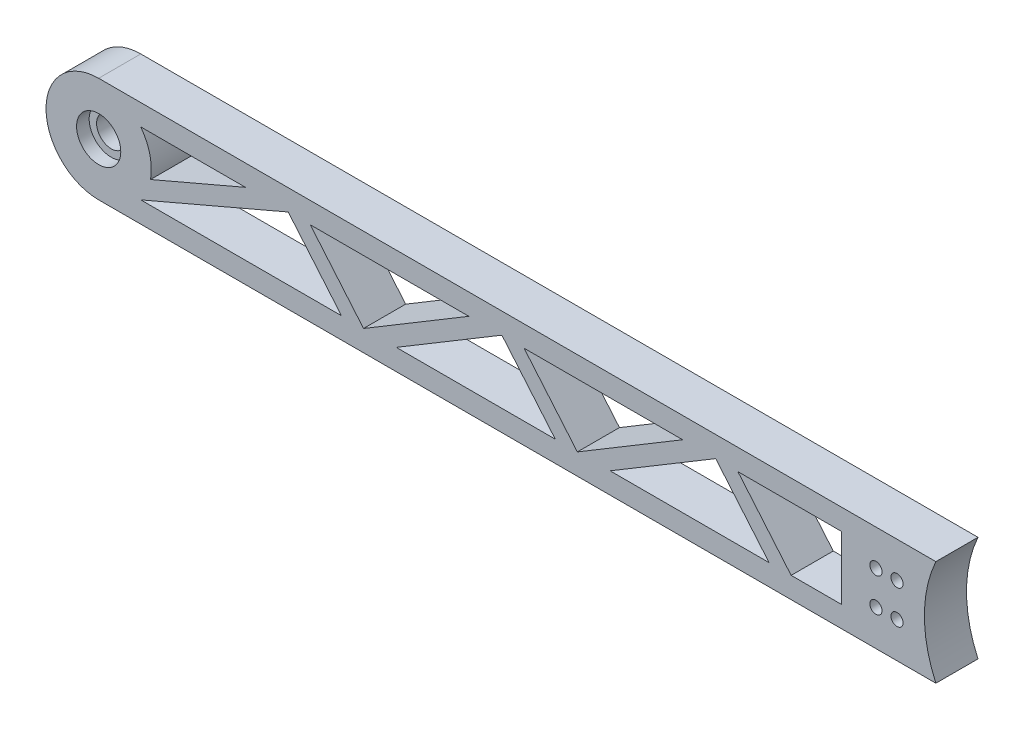
ISO-10303-21;
HEADER;
FILE_DESCRIPTION(('STEP AP214'),'2;1');
FILE_NAME('part.step','',(''),(''),'','','');
FILE_SCHEMA(('AUTOMOTIVE_DESIGN { 1 0 10303 214 1 1 1 1 }'));
ENDSEC;
DATA;
#1=APPLICATION_CONTEXT('core data for automotive mechanical design processes');
#2=APPLICATION_PROTOCOL_DEFINITION('international standard','automotive_design',2000,#1);
#3=PRODUCT_CONTEXT('',#1,'mechanical');
#4=PRODUCT('Part','Part','',(#3));
#5=PRODUCT_RELATED_PRODUCT_CATEGORY('part','',(#4));
#6=PRODUCT_DEFINITION_FORMATION('','',#4);
#7=PRODUCT_DEFINITION_CONTEXT('part definition',#1,'design');
#8=PRODUCT_DEFINITION('design','',#6,#7);
#9=PRODUCT_DEFINITION_SHAPE('','',#8);
#10=(LENGTH_UNIT() NAMED_UNIT(*) SI_UNIT(.MILLI.,.METRE.));
#11=(NAMED_UNIT(*) PLANE_ANGLE_UNIT() SI_UNIT($,.RADIAN.));
#12=(NAMED_UNIT(*) SI_UNIT($,.STERADIAN.) SOLID_ANGLE_UNIT());
#13=UNCERTAINTY_MEASURE_WITH_UNIT(LENGTH_MEASURE(1.E-05),#10,'distance_accuracy_value','');
#14=(GEOMETRIC_REPRESENTATION_CONTEXT(3) GLOBAL_UNCERTAINTY_ASSIGNED_CONTEXT((#13)) GLOBAL_UNIT_ASSIGNED_CONTEXT((#10,
#11,#12)) REPRESENTATION_CONTEXT('',''));
#15=CARTESIAN_POINT('',(0.,0.,0.));
#16=DIRECTION('',(0.,0.,1.));
#17=DIRECTION('',(1.,0.,0.));
#18=AXIS2_PLACEMENT_3D('',#15,#16,#17);
#19=CARTESIAN_POINT('',(0.,0.,10.000055));
#20=DIRECTION('',(0.,0.,-1.));
#21=DIRECTION('',(-1.,0.,0.));
#22=AXIS2_PLACEMENT_3D('',#19,#20,#21);
#23=CYLINDRICAL_SURFACE('',#22,3.5);
#24=CARTESIAN_POINT('',(0.,0.,0.));
#25=DIRECTION('',(0.,0.,-1.));
#26=DIRECTION('',(-1.,0.,0.));
#27=AXIS2_PLACEMENT_3D('',#24,#25,#26);
#28=CIRCLE('',#27,3.5);
#29=CARTESIAN_POINT('',(-3.5,0.,0.));
#30=VERTEX_POINT('',#29);
#31=EDGE_CURVE('E517',#30,#30,#28,.T.);
#32=ORIENTED_EDGE('',*,*,#31,.T.);
#33=EDGE_LOOP('',(#32));
#34=FACE_BOUND('',#33,.T.);
#35=CARTESIAN_POINT('',(0.,0.,7.));
#36=DIRECTION('',(0.,0.,1.));
#37=DIRECTION('',(1.,0.,0.));
#38=AXIS2_PLACEMENT_3D('',#35,#36,#37);
#39=CIRCLE('',#38,3.5);
#40=CARTESIAN_POINT('',(3.5,0.,7.));
#41=VERTEX_POINT('',#40);
#42=EDGE_CURVE('E514',#41,#41,#39,.F.);
#43=ORIENTED_EDGE('',*,*,#42,.F.);
#44=EDGE_LOOP('',(#43));
#45=FACE_BOUND('',#44,.T.);
#46=ADVANCED_FACE('F283',(#34,#45),#23,.F.);
#47=CARTESIAN_POINT('',(0.,0.,10.));
#48=DIRECTION('',(0.,0.,1.));
#49=DIRECTION('',(1.,0.,0.));
#50=AXIS2_PLACEMENT_3D('',#47,#48,#49);
#51=PLANE('',#50);
#52=CARTESIAN_POINT('',(184.5,-4.,10.));
#53=DIRECTION('',(0.,0.,1.));
#54=DIRECTION('',(1.,0.,0.));
#55=AXIS2_PLACEMENT_3D('',#52,#53,#54);
#56=CIRCLE('',#55,1.45);
#57=CARTESIAN_POINT('',(185.95,-4.,10.));
#58=VERTEX_POINT('',#57);
#59=EDGE_CURVE('E966',#58,#58,#56,.T.);
#60=ORIENTED_EDGE('',*,*,#59,.F.);
#61=EDGE_LOOP('',(#60));
#62=FACE_BOUND('',#61,.T.);
#63=CARTESIAN_POINT('',(189.5,-4.,10.));
#64=DIRECTION('',(0.,0.,1.));
#65=DIRECTION('',(1.,0.,0.));
#66=AXIS2_PLACEMENT_3D('',#63,#64,#65);
#67=CIRCLE('',#66,1.45);
#68=CARTESIAN_POINT('',(190.95,-4.,10.));
#69=VERTEX_POINT('',#68);
#70=EDGE_CURVE('E962',#69,#69,#67,.T.);
#71=ORIENTED_EDGE('',*,*,#70,.F.);
#72=EDGE_LOOP('',(#71));
#73=FACE_BOUND('',#72,.T.);
#74=CARTESIAN_POINT('',(189.5,4.,10.));
#75=DIRECTION('',(0.,0.,1.));
#76=DIRECTION('',(1.,0.,0.));
#77=AXIS2_PLACEMENT_3D('',#74,#75,#76);
#78=CIRCLE('',#77,1.45);
#79=CARTESIAN_POINT('',(190.95,4.,10.));
#80=VERTEX_POINT('',#79);
#81=EDGE_CURVE('E944',#80,#80,#78,.T.);
#82=ORIENTED_EDGE('',*,*,#81,.F.);
#83=EDGE_LOOP('',(#82));
#84=FACE_BOUND('',#83,.T.);
#85=CARTESIAN_POINT('',(184.5,4.,10.));
#86=DIRECTION('',(0.,0.,1.));
#87=DIRECTION('',(1.,0.,0.));
#88=AXIS2_PLACEMENT_3D('',#85,#86,#87);
#89=CIRCLE('',#88,1.45);
#90=CARTESIAN_POINT('',(185.95,4.,10.));
#91=VERTEX_POINT('',#90);
#92=EDGE_CURVE('E523',#91,#91,#89,.T.);
#93=ORIENTED_EDGE('',*,*,#92,.F.);
#94=EDGE_LOOP('',(#93));
#95=FACE_BOUND('',#94,.T.);
#96=CARTESIAN_POINT('',(226.,0.,10.));
#97=DIRECTION('',(0.,0.,1.));
#98=DIRECTION('',(1.,0.,0.));
#99=AXIS2_PLACEMENT_3D('',#96,#97,#98);
#100=CIRCLE('',#99,30.);
#101=CARTESIAN_POINT('',(198.728219713411,12.5,10.));
#102=VERTEX_POINT('',#101);
#103=CARTESIAN_POINT('',(198.728219713411,-12.5,10.));
#104=VERTEX_POINT('',#103);
#105=EDGE_CURVE('E530',#102,#104,#100,.T.);
#106=ORIENTED_EDGE('',*,*,#105,.F.);
#107=DIRECTION('',(-1.,0.,0.));
#108=VECTOR('',#107,1.);
#109=CARTESIAN_POINT('',(0.,12.5,10.));
#110=LINE('',#109,#108);
#111=CARTESIAN_POINT('',(0.,12.5,10.));
#112=VERTEX_POINT('',#111);
#113=EDGE_CURVE('E496',#102,#112,#110,.T.);
#114=ORIENTED_EDGE('',*,*,#113,.T.);
#115=CARTESIAN_POINT('',(0.,0.,10.));
#116=DIRECTION('',(0.,0.,1.));
#117=DIRECTION('',(1.,0.,0.));
#118=AXIS2_PLACEMENT_3D('',#115,#116,#117);
#119=CIRCLE('',#118,12.5);
#120=CARTESIAN_POINT('',(0.,-12.5,10.));
#121=VERTEX_POINT('',#120);
#122=EDGE_CURVE('E489',#112,#121,#119,.T.);
#123=ORIENTED_EDGE('',*,*,#122,.T.);
#124=DIRECTION('',(1.,0.,0.));
#125=VECTOR('',#124,1.);
#126=CARTESIAN_POINT('',(0.,-12.5,10.));
#127=LINE('',#126,#125);
#128=EDGE_CURVE('E492',#121,#104,#127,.T.);
#129=ORIENTED_EDGE('',*,*,#128,.T.);
#130=EDGE_LOOP('',(#106,#114,#123,#129));
#131=FACE_BOUND('',#130,.T.);
#132=CARTESIAN_POINT('',(0.,0.,10.));
#133=DIRECTION('',(0.,0.,1.));
#134=DIRECTION('',(1.,0.,0.));
#135=AXIS2_PLACEMENT_3D('',#132,#133,#134);
#136=CIRCLE('',#135,5.25);
#137=CARTESIAN_POINT('',(5.25,0.,10.));
#138=VERTEX_POINT('',#137);
#139=EDGE_CURVE('E545',#138,#138,#136,.T.);
#140=ORIENTED_EDGE('',*,*,#139,.F.);
#141=EDGE_LOOP('',(#140));
#142=FACE_BOUND('',#141,.T.);
#143=DIRECTION('',(0.644427186177513,-0.764665679702792,0.));
#144=VECTOR('',#143,1.);
#145=CARTESIAN_POINT('',(33.0665599385315,27.8670675870274,10.));
#146=LINE('',#145,#144);
#147=CARTESIAN_POINT('',(50.2310442408697,7.5,10.));
#148=VERTEX_POINT('',#147);
#149=CARTESIAN_POINT('',(62.8723959442963,-7.50000000000001,10.));
#150=VERTEX_POINT('',#149);
#151=EDGE_CURVE('E455',#148,#150,#146,.T.);
#152=ORIENTED_EDGE('',*,*,#151,.F.);
#153=DIRECTION('',(1.,0.,0.));
#154=VECTOR('',#153,1.);
#155=CARTESIAN_POINT('',(0.,7.5,10.));
#156=LINE('',#155,#154);
#157=CARTESIAN_POINT('',(87.8723959442963,7.49999999999999,10.));
#158=VERTEX_POINT('',#157);
#159=EDGE_CURVE('E459',#148,#158,#156,.T.);
#160=ORIENTED_EDGE('',*,*,#159,.T.);
#161=DIRECTION('',(0.857492925712545,0.514495755427526,0.));
#162=VECTOR('',#161,1.);
#163=CARTESIAN_POINT('',(19.9515165734902,-33.2525276224836,10.));
#164=LINE('',#163,#162);
#165=EDGE_CURVE('E691',#150,#158,#164,.T.);
#166=ORIENTED_EDGE('',*,*,#165,.F.);
#167=EDGE_LOOP('',(#152,#160,#166));
#168=FACE_BOUND('',#167,.T.);
#169=DIRECTION('',(-0.919145030018058,-0.393919298579168,0.));
#170=VECTOR('',#169,1.);
#171=CARTESIAN_POINT('',(34.8456358588481,7.50000000000001,10.));
#172=LINE('',#171,#170);
#173=CARTESIAN_POINT('',(34.8456358588481,7.5,10.));
#174=VERTEX_POINT('',#173);
#175=CARTESIAN_POINT('',(12.3124755692208,-2.15706869555459,10.));
#176=VERTEX_POINT('',#175);
#177=EDGE_CURVE('E506',#174,#176,#172,.T.);
#178=ORIENTED_EDGE('',*,*,#177,.T.);
#179=CARTESIAN_POINT('',(0.,0.,10.));
#180=DIRECTION('',(0.,0.,1.));
#181=DIRECTION('',(1.,0.,0.));
#182=AXIS2_PLACEMENT_3D('',#179,#180,#181);
#183=CIRCLE('',#182,12.5);
#184=CARTESIAN_POINT('',(10.,7.5,10.));
#185=VERTEX_POINT('',#184);
#186=EDGE_CURVE('E511',#176,#185,#183,.T.);
#187=ORIENTED_EDGE('',*,*,#186,.T.);
#188=DIRECTION('',(1.,0.,0.));
#189=VECTOR('',#188,1.);
#190=CARTESIAN_POINT('',(0.,7.5,10.));
#191=LINE('',#190,#189);
#192=EDGE_CURVE('E331',#185,#174,#191,.T.);
#193=ORIENTED_EDGE('',*,*,#192,.T.);
#194=EDGE_LOOP('',(#178,#187,#193));
#195=FACE_BOUND('',#194,.T.);
#196=DIRECTION('',(0.644427186177513,-0.764665679702792,0.));
#197=VECTOR('',#196,1.);
#198=CARTESIAN_POINT('',(62.7420644515224,52.87630022205,10.));
#199=LINE('',#198,#197);
#200=CARTESIAN_POINT('',(100.983249125336,7.5,10.));
#201=VERTEX_POINT('',#200);
#202=CARTESIAN_POINT('',(113.624600828763,-7.5,10.));
#203=VERTEX_POINT('',#202);
#204=EDGE_CURVE('E340',#201,#203,#199,.T.);
#205=ORIENTED_EDGE('',*,*,#204,.F.);
#206=DIRECTION('',(1.,0.,0.));
#207=VECTOR('',#206,1.);
#208=CARTESIAN_POINT('',(0.,7.5,10.));
#209=LINE('',#208,#207);
#210=CARTESIAN_POINT('',(138.624600828763,7.5,10.));
#211=VERTEX_POINT('',#210);
#212=EDGE_CURVE('E678',#201,#211,#209,.T.);
#213=ORIENTED_EDGE('',*,*,#212,.T.);
#214=DIRECTION('',(0.857492925712545,0.514495755427526,0.));
#215=VECTOR('',#214,1.);
#216=CARTESIAN_POINT('',(33.3859237487901,-55.6432062479835,10.));
#217=LINE('',#216,#215);
#218=EDGE_CURVE('E676',#203,#211,#217,.T.);
#219=ORIENTED_EDGE('',*,*,#218,.F.);
#220=EDGE_LOOP('',(#205,#213,#219));
#221=FACE_BOUND('',#220,.T.);
#222=DIRECTION('',(0.644427186177514,-0.764665679702791,0.));
#223=VECTOR('',#222,1.);
#224=CARTESIAN_POINT('',(92.4175689645131,77.8855328570726,10.));
#225=LINE('',#224,#223);
#226=CARTESIAN_POINT('',(151.735454009803,7.50000000000001,10.));
#227=VERTEX_POINT('',#226);
#228=CARTESIAN_POINT('',(164.376805713229,-7.5,10.));
#229=VERTEX_POINT('',#228);
#230=EDGE_CURVE('E681',#227,#229,#225,.T.);
#231=ORIENTED_EDGE('',*,*,#230,.F.);
#232=DIRECTION('',(1.,0.,0.));
#233=VECTOR('',#232,1.);
#234=CARTESIAN_POINT('',(0.,7.5,10.));
#235=LINE('',#234,#233);
#236=CARTESIAN_POINT('',(176.376805713229,7.5,10.));
#237=VERTEX_POINT('',#236);
#238=EDGE_CURVE('E688',#227,#237,#235,.T.);
#239=ORIENTED_EDGE('',*,*,#238,.T.);
#240=DIRECTION('',(0.,-1.,0.));
#241=VECTOR('',#240,1.);
#242=CARTESIAN_POINT('',(176.376805713229,0.,10.));
#243=LINE('',#242,#241);
#244=CARTESIAN_POINT('',(176.376805713229,-7.5,10.));
#245=VERTEX_POINT('',#244);
#246=EDGE_CURVE('E685',#237,#245,#243,.T.);
#247=ORIENTED_EDGE('',*,*,#246,.T.);
#248=DIRECTION('',(1.,0.,0.));
#249=VECTOR('',#248,1.);
#250=CARTESIAN_POINT('',(0.,-7.5,10.));
#251=LINE('',#250,#249);
#252=EDGE_CURVE('E683',#229,#245,#251,.T.);
#253=ORIENTED_EDGE('',*,*,#252,.F.);
#254=EDGE_LOOP('',(#231,#239,#247,#253));
#255=FACE_BOUND('',#254,.T.);
#256=DIRECTION('',(0.919145030018058,0.393919298579168,0.));
#257=VECTOR('',#256,1.);
#258=CARTESIAN_POINT('',(4.26724137931035,-9.95689655172414,10.));
#259=LINE('',#258,#257);
#260=CARTESIAN_POINT('',(10.,-7.5,10.));
#261=VERTEX_POINT('',#260);
#262=CARTESIAN_POINT('',(45.,7.5,10.));
#263=VERTEX_POINT('',#262);
#264=EDGE_CURVE('E431',#261,#263,#259,.T.);
#265=ORIENTED_EDGE('',*,*,#264,.T.);
#266=DIRECTION('',(0.644427186177514,-0.764665679702792,0.));
#267=VECTOR('',#266,1.);
#268=CARTESIAN_POINT('',(30.0078972197203,25.2893588423174,10.));
#269=LINE('',#268,#267);
#270=CARTESIAN_POINT('',(57.6413517034265,-7.5,10.));
#271=VERTEX_POINT('',#270);
#272=EDGE_CURVE('E444',#263,#271,#269,.T.);
#273=ORIENTED_EDGE('',*,*,#272,.T.);
#274=DIRECTION('',(1.,0.,0.));
#275=VECTOR('',#274,1.);
#276=CARTESIAN_POINT('',(0.,-7.5,10.));
#277=LINE('',#276,#275);
#278=EDGE_CURVE('E451',#261,#271,#277,.T.);
#279=ORIENTED_EDGE('',*,*,#278,.F.);
#280=EDGE_LOOP('',(#265,#273,#279));
#281=FACE_BOUND('',#280,.T.);
#282=DIRECTION('',(1.,0.,0.));
#283=VECTOR('',#282,1.);
#284=CARTESIAN_POINT('',(0.,7.5,10.));
#285=LINE('',#284,#283);
#286=CARTESIAN_POINT('',(95.6469984707566,7.5,10.));
#287=VERTEX_POINT('',#286);
#288=CARTESIAN_POINT('',(95.7522048844664,7.5,10.));
#289=VERTEX_POINT('',#288);
#290=EDGE_CURVE('E450',#287,#289,#285,.T.);
#291=ORIENTED_EDGE('',*,*,#290,.T.);
#292=DIRECTION('',(0.644427186177514,-0.764665679702792,0.));
#293=VECTOR('',#292,1.);
#294=CARTESIAN_POINT('',(59.6834017327112,50.29859147734,10.));
#295=LINE('',#294,#293);
#296=CARTESIAN_POINT('',(108.393556587893,-7.5,10.));
#297=VERTEX_POINT('',#296);
#298=EDGE_CURVE('E474',#289,#297,#295,.T.);
#299=ORIENTED_EDGE('',*,*,#298,.T.);
#300=DIRECTION('',(1.,0.,0.));
#301=VECTOR('',#300,1.);
#302=CARTESIAN_POINT('',(0.,-7.5,10.));
#303=LINE('',#302,#301);
#304=CARTESIAN_POINT('',(70.6469984707566,-7.5,10.));
#305=VERTEX_POINT('',#304);
#306=EDGE_CURVE('E472',#305,#297,#303,.T.);
#307=ORIENTED_EDGE('',*,*,#306,.F.);
#308=DIRECTION('',(0.857492925712544,0.514495755427526,0.));
#309=VECTOR('',#308,1.);
#310=CARTESIAN_POINT('',(22.0094995952003,-36.6824993253338,10.));
#311=LINE('',#310,#309);
#312=EDGE_CURVE('E469',#305,#287,#311,.T.);
#313=ORIENTED_EDGE('',*,*,#312,.T.);
#314=EDGE_LOOP('',(#291,#299,#307,#313));
#315=FACE_BOUND('',#314,.T.);
#316=DIRECTION('',(1.,0.,0.));
#317=VECTOR('',#316,1.);
#318=CARTESIAN_POINT('',(0.,7.5,10.));
#319=LINE('',#318,#317);
#320=CARTESIAN_POINT('',(146.399203355223,7.5,10.));
#321=VERTEX_POINT('',#320);
#322=CARTESIAN_POINT('',(146.504409768933,7.5,10.));
#323=VERTEX_POINT('',#322);
#324=EDGE_CURVE('E477',#321,#323,#319,.T.);
#325=ORIENTED_EDGE('',*,*,#324,.T.);
#326=DIRECTION('',(0.644427186177514,-0.764665679702791,0.));
#327=VECTOR('',#326,1.);
#328=CARTESIAN_POINT('',(89.358906245702,75.3078241123626,10.));
#329=LINE('',#328,#327);
#330=CARTESIAN_POINT('',(159.145761472359,-7.5,10.));
#331=VERTEX_POINT('',#330);
#332=EDGE_CURVE('E485',#323,#331,#329,.T.);
#333=ORIENTED_EDGE('',*,*,#332,.T.);
#334=DIRECTION('',(1.,0.,0.));
#335=VECTOR('',#334,1.);
#336=CARTESIAN_POINT('',(0.,-7.5,10.));
#337=LINE('',#336,#335);
#338=CARTESIAN_POINT('',(121.399203355223,-7.5,10.));
#339=VERTEX_POINT('',#338);
#340=EDGE_CURVE('E483',#339,#331,#337,.T.);
#341=ORIENTED_EDGE('',*,*,#340,.F.);
#342=DIRECTION('',(0.857492925712545,0.514495755427526,0.));
#343=VECTOR('',#342,1.);
#344=CARTESIAN_POINT('',(35.4439067705002,-59.0731779508337,10.));
#345=LINE('',#344,#343);
#346=EDGE_CURVE('E480',#339,#321,#345,.T.);
#347=ORIENTED_EDGE('',*,*,#346,.T.);
#348=EDGE_LOOP('',(#325,#333,#341,#347));
#349=FACE_BOUND('',#348,.T.);
#350=ADVANCED_FACE('F453',(#62,#73,#84,#95,#131,#142,#168,#195,#221,#255,#281,#315,#349),#51,.T.);
#351=CARTESIAN_POINT('',(0.,0.,0.));
#352=DIRECTION('',(0.,0.,1.));
#353=DIRECTION('',(1.,0.,0.));
#354=AXIS2_PLACEMENT_3D('',#351,#352,#353);
#355=PLANE('',#354);
#356=CARTESIAN_POINT('',(184.5,-4.,0.));
#357=DIRECTION('',(0.,0.,1.));
#358=DIRECTION('',(1.,0.,0.));
#359=AXIS2_PLACEMENT_3D('',#356,#357,#358);
#360=CIRCLE('',#359,1.45);
#361=CARTESIAN_POINT('',(185.95,-4.,0.));
#362=VERTEX_POINT('',#361);
#363=EDGE_CURVE('E287',#362,#362,#360,.T.);
#364=ORIENTED_EDGE('',*,*,#363,.T.);
#365=EDGE_LOOP('',(#364));
#366=FACE_BOUND('',#365,.T.);
#367=CARTESIAN_POINT('',(189.5,-4.,0.));
#368=DIRECTION('',(0.,0.,1.));
#369=DIRECTION('',(1.,0.,0.));
#370=AXIS2_PLACEMENT_3D('',#367,#368,#369);
#371=CIRCLE('',#370,1.45);
#372=CARTESIAN_POINT('',(190.95,-4.,0.));
#373=VERTEX_POINT('',#372);
#374=EDGE_CURVE('E525',#373,#373,#371,.T.);
#375=ORIENTED_EDGE('',*,*,#374,.T.);
#376=EDGE_LOOP('',(#375));
#377=FACE_BOUND('',#376,.T.);
#378=CARTESIAN_POINT('',(189.5,4.,0.));
#379=DIRECTION('',(0.,0.,1.));
#380=DIRECTION('',(1.,0.,0.));
#381=AXIS2_PLACEMENT_3D('',#378,#379,#380);
#382=CIRCLE('',#381,1.45);
#383=CARTESIAN_POINT('',(190.95,4.,0.));
#384=VERTEX_POINT('',#383);
#385=EDGE_CURVE('E522',#384,#384,#382,.T.);
#386=ORIENTED_EDGE('',*,*,#385,.T.);
#387=EDGE_LOOP('',(#386));
#388=FACE_BOUND('',#387,.T.);
#389=CARTESIAN_POINT('',(184.5,4.,0.));
#390=DIRECTION('',(0.,0.,1.));
#391=DIRECTION('',(1.,0.,0.));
#392=AXIS2_PLACEMENT_3D('',#389,#390,#391);
#393=CIRCLE('',#392,1.45);
#394=CARTESIAN_POINT('',(185.95,4.,0.));
#395=VERTEX_POINT('',#394);
#396=EDGE_CURVE('E519',#395,#395,#393,.T.);
#397=ORIENTED_EDGE('',*,*,#396,.T.);
#398=EDGE_LOOP('',(#397));
#399=FACE_BOUND('',#398,.T.);
#400=ORIENTED_EDGE('',*,*,#31,.F.);
#401=EDGE_LOOP('',(#400));
#402=FACE_BOUND('',#401,.T.);
#403=DIRECTION('',(0.644427186177514,-0.764665679702792,0.));
#404=VECTOR('',#403,1.);
#405=CARTESIAN_POINT('',(59.6834017327112,50.29859147734,0.));
#406=LINE('',#405,#404);
#407=CARTESIAN_POINT('',(95.7522048844664,7.5,0.));
#408=VERTEX_POINT('',#407);
#409=CARTESIAN_POINT('',(108.393556587893,-7.5,0.));
#410=VERTEX_POINT('',#409);
#411=EDGE_CURVE('E592',#408,#410,#406,.T.);
#412=ORIENTED_EDGE('',*,*,#411,.F.);
#413=DIRECTION('',(1.,0.,0.));
#414=VECTOR('',#413,1.);
#415=CARTESIAN_POINT('',(0.,7.5,0.));
#416=LINE('',#415,#414);
#417=CARTESIAN_POINT('',(95.6469984707566,7.5,0.));
#418=VERTEX_POINT('',#417);
#419=EDGE_CURVE('E595',#418,#408,#416,.T.);
#420=ORIENTED_EDGE('',*,*,#419,.F.);
#421=DIRECTION('',(0.857492925712544,0.514495755427526,0.));
#422=VECTOR('',#421,1.);
#423=CARTESIAN_POINT('',(22.0094995952003,-36.6824993253338,0.));
#424=LINE('',#423,#422);
#425=CARTESIAN_POINT('',(70.6469984707566,-7.5,0.));
#426=VERTEX_POINT('',#425);
#427=EDGE_CURVE('E599',#426,#418,#424,.T.);
#428=ORIENTED_EDGE('',*,*,#427,.F.);
#429=DIRECTION('',(1.,0.,0.));
#430=VECTOR('',#429,1.);
#431=CARTESIAN_POINT('',(0.,-7.5,0.));
#432=LINE('',#431,#430);
#433=EDGE_CURVE('E602',#426,#410,#432,.T.);
#434=ORIENTED_EDGE('',*,*,#433,.T.);
#435=EDGE_LOOP('',(#412,#420,#428,#434));
#436=FACE_BOUND('',#435,.T.);
#437=DIRECTION('',(1.,0.,0.));
#438=VECTOR('',#437,1.);
#439=CARTESIAN_POINT('',(0.,7.5,0.));
#440=LINE('',#439,#438);
#441=CARTESIAN_POINT('',(151.735454009803,7.50000000000001,0.));
#442=VERTEX_POINT('',#441);
#443=CARTESIAN_POINT('',(176.376805713229,7.5,0.));
#444=VERTEX_POINT('',#443);
#445=EDGE_CURVE('E553',#442,#444,#440,.T.);
#446=ORIENTED_EDGE('',*,*,#445,.F.);
#447=DIRECTION('',(0.644427186177514,-0.764665679702791,0.));
#448=VECTOR('',#447,1.);
#449=CARTESIAN_POINT('',(92.4175689645131,77.8855328570727,0.));
#450=LINE('',#449,#448);
#451=CARTESIAN_POINT('',(164.376805713229,-7.49999999999999,0.));
#452=VERTEX_POINT('',#451);
#453=EDGE_CURVE('E556',#442,#452,#450,.T.);
#454=ORIENTED_EDGE('',*,*,#453,.T.);
#455=DIRECTION('',(1.,0.,0.));
#456=VECTOR('',#455,1.);
#457=CARTESIAN_POINT('',(0.,-7.5,0.));
#458=LINE('',#457,#456);
#459=CARTESIAN_POINT('',(176.376805713229,-7.5,0.));
#460=VERTEX_POINT('',#459);
#461=EDGE_CURVE('E560',#452,#460,#458,.T.);
#462=ORIENTED_EDGE('',*,*,#461,.T.);
#463=DIRECTION('',(0.,-1.,0.));
#464=VECTOR('',#463,1.);
#465=CARTESIAN_POINT('',(176.376805713229,0.,0.));
#466=LINE('',#465,#464);
#467=EDGE_CURVE('E563',#444,#460,#466,.T.);
#468=ORIENTED_EDGE('',*,*,#467,.F.);
#469=EDGE_LOOP('',(#446,#454,#462,#468));
#470=FACE_BOUND('',#469,.T.);
#471=CARTESIAN_POINT('',(0.,0.,0.));
#472=DIRECTION('',(0.,0.,1.));
#473=DIRECTION('',(1.,0.,0.));
#474=AXIS2_PLACEMENT_3D('',#471,#472,#473);
#475=CIRCLE('',#474,12.5);
#476=CARTESIAN_POINT('',(12.3124755692208,-2.15706869555459,0.));
#477=VERTEX_POINT('',#476);
#478=CARTESIAN_POINT('',(10.,7.5,0.));
#479=VERTEX_POINT('',#478);
#480=EDGE_CURVE('E657',#477,#479,#475,.T.);
#481=ORIENTED_EDGE('',*,*,#480,.F.);
#482=DIRECTION('',(-0.919145030018058,-0.393919298579168,0.));
#483=VECTOR('',#482,1.);
#484=CARTESIAN_POINT('',(2.69156418499368,-6.28031643165192,0.));
#485=LINE('',#484,#483);
#486=CARTESIAN_POINT('',(34.8456358588481,7.5,0.));
#487=VERTEX_POINT('',#486);
#488=EDGE_CURVE('E664',#487,#477,#485,.T.);
#489=ORIENTED_EDGE('',*,*,#488,.F.);
#490=DIRECTION('',(1.,0.,0.));
#491=VECTOR('',#490,1.);
#492=CARTESIAN_POINT('',(0.,7.5,0.));
#493=LINE('',#492,#491);
#494=EDGE_CURVE('E667',#479,#487,#493,.T.);
#495=ORIENTED_EDGE('',*,*,#494,.F.);
#496=EDGE_LOOP('',(#481,#489,#495));
#497=FACE_BOUND('',#496,.T.);
#498=DIRECTION('',(-1.,0.,0.));
#499=VECTOR('',#498,1.);
#500=CARTESIAN_POINT('',(0.,12.5,0.));
#501=LINE('',#500,#499);
#502=CARTESIAN_POINT('',(198.728219713411,12.5,0.));
#503=VERTEX_POINT('',#502);
#504=CARTESIAN_POINT('',(0.,12.5,0.));
#505=VERTEX_POINT('',#504);
#506=EDGE_CURVE('E493',#503,#505,#501,.T.);
#507=ORIENTED_EDGE('',*,*,#506,.F.);
#508=CARTESIAN_POINT('',(226.,0.,0.));
#509=DIRECTION('',(0.,0.,1.));
#510=DIRECTION('',(1.,0.,0.));
#511=AXIS2_PLACEMENT_3D('',#508,#509,#510);
#512=CIRCLE('',#511,30.);
#513=CARTESIAN_POINT('',(198.728219713411,-12.5,0.));
#514=VERTEX_POINT('',#513);
#515=EDGE_CURVE('E300',#503,#514,#512,.T.);
#516=ORIENTED_EDGE('',*,*,#515,.T.);
#517=DIRECTION('',(1.,0.,0.));
#518=VECTOR('',#517,1.);
#519=CARTESIAN_POINT('',(0.,-12.5,0.));
#520=LINE('',#519,#518);
#521=CARTESIAN_POINT('',(0.,-12.5,0.));
#522=VERTEX_POINT('',#521);
#523=EDGE_CURVE('E500',#522,#514,#520,.T.);
#524=ORIENTED_EDGE('',*,*,#523,.F.);
#525=CARTESIAN_POINT('',(0.,0.,0.));
#526=DIRECTION('',(0.,0.,1.));
#527=DIRECTION('',(1.,0.,0.));
#528=AXIS2_PLACEMENT_3D('',#525,#526,#527);
#529=CIRCLE('',#528,12.5);
#530=EDGE_CURVE('E488',#505,#522,#529,.T.);
#531=ORIENTED_EDGE('',*,*,#530,.F.);
#532=EDGE_LOOP('',(#507,#516,#524,#531));
#533=FACE_BOUND('',#532,.T.);
#534=DIRECTION('',(1.,0.,0.));
#535=VECTOR('',#534,1.);
#536=CARTESIAN_POINT('',(0.,7.5,0.));
#537=LINE('',#536,#535);
#538=CARTESIAN_POINT('',(100.983249125336,7.5,0.));
#539=VERTEX_POINT('',#538);
#540=CARTESIAN_POINT('',(138.624600828763,7.5,0.));
#541=VERTEX_POINT('',#540);
#542=EDGE_CURVE('E552',#539,#541,#537,.T.);
#543=ORIENTED_EDGE('',*,*,#542,.F.);
#544=DIRECTION('',(0.644427186177513,-0.764665679702792,0.));
#545=VECTOR('',#544,1.);
#546=CARTESIAN_POINT('',(62.7420644515224,52.87630022205,0.));
#547=LINE('',#546,#545);
#548=CARTESIAN_POINT('',(113.624600828763,-7.5,0.));
#549=VERTEX_POINT('',#548);
#550=EDGE_CURVE('E580',#539,#549,#547,.T.);
#551=ORIENTED_EDGE('',*,*,#550,.T.);
#552=DIRECTION('',(0.857492925712545,0.514495755427526,0.));
#553=VECTOR('',#552,1.);
#554=CARTESIAN_POINT('',(33.3859237487901,-55.6432062479835,0.));
#555=LINE('',#554,#553);
#556=EDGE_CURVE('E583',#549,#541,#555,.T.);
#557=ORIENTED_EDGE('',*,*,#556,.T.);
#558=EDGE_LOOP('',(#543,#551,#557));
#559=FACE_BOUND('',#558,.T.);
#560=DIRECTION('',(1.,0.,0.));
#561=VECTOR('',#560,1.);
#562=CARTESIAN_POINT('',(0.,7.5,0.));
#563=LINE('',#562,#561);
#564=CARTESIAN_POINT('',(50.2310442408697,7.5,0.));
#565=VERTEX_POINT('',#564);
#566=CARTESIAN_POINT('',(87.8723959442963,7.49999999999998,0.));
#567=VERTEX_POINT('',#566);
#568=EDGE_CURVE('E641',#565,#567,#563,.T.);
#569=ORIENTED_EDGE('',*,*,#568,.F.);
#570=DIRECTION('',(0.644427186177513,-0.764665679702792,0.));
#571=VECTOR('',#570,1.);
#572=CARTESIAN_POINT('',(33.0665599385315,27.8670675870274,0.));
#573=LINE('',#572,#571);
#574=CARTESIAN_POINT('',(62.8723959442963,-7.5,0.));
#575=VERTEX_POINT('',#574);
#576=EDGE_CURVE('E609',#565,#575,#573,.T.);
#577=ORIENTED_EDGE('',*,*,#576,.T.);
#578=DIRECTION('',(0.857492925712545,0.514495755427526,0.));
#579=VECTOR('',#578,1.);
#580=CARTESIAN_POINT('',(19.9515165734902,-33.2525276224836,0.));
#581=LINE('',#580,#579);
#582=EDGE_CURVE('E638',#575,#567,#581,.T.);
#583=ORIENTED_EDGE('',*,*,#582,.T.);
#584=EDGE_LOOP('',(#569,#577,#583));
#585=FACE_BOUND('',#584,.T.);
#586=DIRECTION('',(0.644427186177514,-0.764665679702792,0.));
#587=VECTOR('',#586,1.);
#588=CARTESIAN_POINT('',(30.0078972197203,25.2893588423174,0.));
#589=LINE('',#588,#587);
#590=CARTESIAN_POINT('',(45.,7.5,0.));
#591=VERTEX_POINT('',#590);
#592=CARTESIAN_POINT('',(57.6413517034265,-7.5,0.));
#593=VERTEX_POINT('',#592);
#594=EDGE_CURVE('E648',#591,#593,#589,.T.);
#595=ORIENTED_EDGE('',*,*,#594,.F.);
#596=DIRECTION('',(0.919145030018058,0.393919298579168,0.));
#597=VECTOR('',#596,1.);
#598=CARTESIAN_POINT('',(4.26724137931035,-9.95689655172414,0.));
#599=LINE('',#598,#597);
#600=CARTESIAN_POINT('',(10.,-7.5,0.));
#601=VERTEX_POINT('',#600);
#602=EDGE_CURVE('E435',#601,#591,#599,.T.);
#603=ORIENTED_EDGE('',*,*,#602,.F.);
#604=DIRECTION('',(1.,0.,0.));
#605=VECTOR('',#604,1.);
#606=CARTESIAN_POINT('',(0.,-7.5,0.));
#607=LINE('',#606,#605);
#608=EDGE_CURVE('E440',#601,#593,#607,.T.);
#609=ORIENTED_EDGE('',*,*,#608,.T.);
#610=EDGE_LOOP('',(#595,#603,#609));
#611=FACE_BOUND('',#610,.T.);
#612=DIRECTION('',(0.644427186177514,-0.764665679702791,0.));
#613=VECTOR('',#612,1.);
#614=CARTESIAN_POINT('',(89.358906245702,75.3078241123626,0.));
#615=LINE('',#614,#613);
#616=CARTESIAN_POINT('',(146.504409768933,7.5,0.));
#617=VERTEX_POINT('',#616);
#618=CARTESIAN_POINT('',(159.145761472359,-7.5,0.));
#619=VERTEX_POINT('',#618);
#620=EDGE_CURVE('E570',#617,#619,#615,.T.);
#621=ORIENTED_EDGE('',*,*,#620,.F.);
#622=DIRECTION('',(1.,0.,0.));
#623=VECTOR('',#622,1.);
#624=CARTESIAN_POINT('',(0.,7.5,0.));
#625=LINE('',#624,#623);
#626=CARTESIAN_POINT('',(146.399203355223,7.5,0.));
#627=VERTEX_POINT('',#626);
#628=EDGE_CURVE('E619',#627,#617,#625,.T.);
#629=ORIENTED_EDGE('',*,*,#628,.F.);
#630=DIRECTION('',(0.857492925712545,0.514495755427526,0.));
#631=VECTOR('',#630,1.);
#632=CARTESIAN_POINT('',(35.4439067705002,-59.0731779508337,0.));
#633=LINE('',#632,#631);
#634=CARTESIAN_POINT('',(121.399203355223,-7.5,0.));
#635=VERTEX_POINT('',#634);
#636=EDGE_CURVE('E621',#635,#627,#633,.T.);
#637=ORIENTED_EDGE('',*,*,#636,.F.);
#638=DIRECTION('',(1.,0.,0.));
#639=VECTOR('',#638,1.);
#640=CARTESIAN_POINT('',(0.,-7.5,0.));
#641=LINE('',#640,#639);
#642=EDGE_CURVE('E624',#635,#619,#641,.T.);
#643=ORIENTED_EDGE('',*,*,#642,.T.);
#644=EDGE_LOOP('',(#621,#629,#637,#643));
#645=FACE_BOUND('',#644,.T.);
#646=ADVANCED_FACE('F710',(#366,#377,#388,#399,#402,#436,#470,#497,#533,#559,#585,#611,#645),
#355,.F.);
#647=CARTESIAN_POINT('',(0.,0.,10.));
#648=DIRECTION('',(0.,0.,-1.));
#649=DIRECTION('',(-1.,0.,0.));
#650=AXIS2_PLACEMENT_3D('',#647,#648,#649);
#651=CYLINDRICAL_SURFACE('',#650,12.5);
#652=ORIENTED_EDGE('',*,*,#530,.T.);
#653=DIRECTION('',(0.,0.,-1.));
#654=VECTOR('',#653,1.);
#655=CARTESIAN_POINT('',(0.,-12.5,10.));
#656=LINE('',#655,#654);
#657=EDGE_CURVE('E12',#121,#522,#656,.T.);
#658=ORIENTED_EDGE('',*,*,#657,.F.);
#659=ORIENTED_EDGE('',*,*,#122,.F.);
#660=DIRECTION('',(0.,0.,-1.));
#661=VECTOR('',#660,1.);
#662=CARTESIAN_POINT('',(0.,12.5,10.));
#663=LINE('',#662,#661);
#664=EDGE_CURVE('E292',#112,#505,#663,.T.);
#665=ORIENTED_EDGE('',*,*,#664,.T.);
#666=EDGE_LOOP('',(#652,#658,#659,#665));
#667=FACE_BOUND('',#666,.T.);
#668=ADVANCED_FACE('F285',(#667),#651,.T.);
#669=CARTESIAN_POINT('',(0.,-12.5,10.));
#670=DIRECTION('',(0.,1.,0.));
#671=DIRECTION('',(0.,0.,1.));
#672=AXIS2_PLACEMENT_3D('',#669,#670,#671);
#673=PLANE('',#672);
#674=ORIENTED_EDGE('',*,*,#523,.T.);
#675=DIRECTION('',(0.,0.,1.));
#676=VECTOR('',#675,1.);
#677=CARTESIAN_POINT('',(198.728219713411,-12.5,0.));
#678=LINE('',#677,#676);
#679=EDGE_CURVE('E543',#514,#104,#678,.T.);
#680=ORIENTED_EDGE('',*,*,#679,.T.);
#681=ORIENTED_EDGE('',*,*,#128,.F.);
#682=ORIENTED_EDGE('',*,*,#657,.T.);
#683=EDGE_LOOP('',(#674,#680,#681,#682));
#684=FACE_BOUND('',#683,.T.);
#685=ADVANCED_FACE('F892',(#684),#673,.F.);
#686=CARTESIAN_POINT('',(0.,12.5,10.));
#687=DIRECTION('',(0.,-1.,0.));
#688=DIRECTION('',(0.,0.,-1.));
#689=AXIS2_PLACEMENT_3D('',#686,#687,#688);
#690=PLANE('',#689);
#691=ORIENTED_EDGE('',*,*,#113,.F.);
#692=DIRECTION('',(0.,0.,1.));
#693=VECTOR('',#692,1.);
#694=CARTESIAN_POINT('',(198.728219713411,12.5,0.));
#695=LINE('',#694,#693);
#696=EDGE_CURVE('E538',#102,#503,#695,.F.);
#697=ORIENTED_EDGE('',*,*,#696,.T.);
#698=ORIENTED_EDGE('',*,*,#506,.T.);
#699=ORIENTED_EDGE('',*,*,#664,.F.);
#700=EDGE_LOOP('',(#691,#697,#698,#699));
#701=FACE_BOUND('',#700,.T.);
#702=ADVANCED_FACE('F889',(#701),#690,.F.);
#703=CARTESIAN_POINT('',(0.,0.,0.));
#704=DIRECTION('',(0.,0.,1.));
#705=DIRECTION('',(1.,0.,0.));
#706=AXIS2_PLACEMENT_3D('',#703,#704,#705);
#707=CYLINDRICAL_SURFACE('',#706,12.5);
#708=DIRECTION('',(0.,0.,1.));
#709=VECTOR('',#708,1.);
#710=CARTESIAN_POINT('',(12.3124755692208,-2.15706869555459,0.));
#711=LINE('',#710,#709);
#712=EDGE_CURVE('E670',#477,#176,#711,.T.);
#713=ORIENTED_EDGE('',*,*,#712,.F.);
#714=ORIENTED_EDGE('',*,*,#480,.T.);
#715=DIRECTION('',(0.,0.,1.));
#716=VECTOR('',#715,1.);
#717=CARTESIAN_POINT('',(10.,7.5,0.));
#718=LINE('',#717,#716);
#719=EDGE_CURVE('E509',#479,#185,#718,.T.);
#720=ORIENTED_EDGE('',*,*,#719,.T.);
#721=ORIENTED_EDGE('',*,*,#186,.F.);
#722=EDGE_LOOP('',(#713,#714,#720,#721));
#723=FACE_BOUND('',#722,.T.);
#724=ADVANCED_FACE('F731',(#723),#707,.T.);
#725=CARTESIAN_POINT('',(0.,7.5,0.));
#726=DIRECTION('',(0.,-1.,0.));
#727=DIRECTION('',(0.,0.,-1.));
#728=AXIS2_PLACEMENT_3D('',#725,#726,#727);
#729=PLANE('',#728);
#730=ORIENTED_EDGE('',*,*,#719,.F.);
#731=ORIENTED_EDGE('',*,*,#494,.T.);
#732=DIRECTION('',(0.,0.,1.));
#733=VECTOR('',#732,1.);
#734=CARTESIAN_POINT('',(34.8456358588481,7.5,0.));
#735=LINE('',#734,#733);
#736=EDGE_CURVE('E672',#487,#174,#735,.T.);
#737=ORIENTED_EDGE('',*,*,#736,.T.);
#738=ORIENTED_EDGE('',*,*,#192,.F.);
#739=EDGE_LOOP('',(#730,#731,#737,#738));
#740=FACE_BOUND('',#739,.T.);
#741=ADVANCED_FACE('F735',(#740),#729,.T.);
#742=CARTESIAN_POINT('',(2.69156418499368,-6.28031643165192,0.));
#743=DIRECTION('',(-0.393919298579168,0.919145030018058,0.));
#744=DIRECTION('',(-0.919145030018058,-0.393919298579168,0.));
#745=AXIS2_PLACEMENT_3D('',#742,#743,#744);
#746=PLANE('',#745);
#747=ORIENTED_EDGE('',*,*,#736,.F.);
#748=ORIENTED_EDGE('',*,*,#488,.T.);
#749=ORIENTED_EDGE('',*,*,#712,.T.);
#750=ORIENTED_EDGE('',*,*,#177,.F.);
#751=EDGE_LOOP('',(#747,#748,#749,#750));
#752=FACE_BOUND('',#751,.T.);
#753=ADVANCED_FACE('F846',(#752),#746,.T.);
#754=CARTESIAN_POINT('',(0.,7.5,0.));
#755=DIRECTION('',(0.,-1.,0.));
#756=DIRECTION('',(0.,0.,-1.));
#757=AXIS2_PLACEMENT_3D('',#754,#755,#756);
#758=PLANE('',#757);
#759=DIRECTION('',(0.,0.,1.));
#760=VECTOR('',#759,1.);
#761=CARTESIAN_POINT('',(100.983249125336,7.5,0.));
#762=LINE('',#761,#760);
#763=EDGE_CURVE('E586',#539,#201,#762,.T.);
#764=ORIENTED_EDGE('',*,*,#763,.F.);
#765=ORIENTED_EDGE('',*,*,#542,.T.);
#766=DIRECTION('',(0.,0.,1.));
#767=VECTOR('',#766,1.);
#768=CARTESIAN_POINT('',(138.624600828763,7.5,0.));
#769=LINE('',#768,#767);
#770=EDGE_CURVE('E557',#541,#211,#769,.T.);
#771=ORIENTED_EDGE('',*,*,#770,.T.);
#772=ORIENTED_EDGE('',*,*,#212,.F.);
#773=EDGE_LOOP('',(#764,#765,#771,#772));
#774=FACE_BOUND('',#773,.T.);
#775=ADVANCED_FACE('F751',(#774),#758,.T.);
#776=CARTESIAN_POINT('',(33.3859237487901,-55.6432062479835,0.));
#777=DIRECTION('',(0.514495755427526,-0.857492925712545,0.));
#778=DIRECTION('',(0.857492925712545,0.514495755427526,0.));
#779=AXIS2_PLACEMENT_3D('',#776,#777,#778);
#780=PLANE('',#779);
#781=ORIENTED_EDGE('',*,*,#218,.T.);
#782=ORIENTED_EDGE('',*,*,#770,.F.);
#783=ORIENTED_EDGE('',*,*,#556,.F.);
#784=DIRECTION('',(0.,0.,1.));
#785=VECTOR('',#784,1.);
#786=CARTESIAN_POINT('',(113.624600828763,-7.5,0.));
#787=LINE('',#786,#785);
#788=EDGE_CURVE('E589',#549,#203,#787,.T.);
#789=ORIENTED_EDGE('',*,*,#788,.T.);
#790=EDGE_LOOP('',(#781,#782,#783,#789));
#791=FACE_BOUND('',#790,.T.);
#792=ADVANCED_FACE('F756',(#791),#780,.F.);
#793=CARTESIAN_POINT('',(62.7420644515224,52.87630022205,0.));
#794=DIRECTION('',(-0.764665679702792,-0.644427186177513,0.));
#795=DIRECTION('',(0.644427186177513,-0.764665679702792,0.));
#796=AXIS2_PLACEMENT_3D('',#793,#794,#795);
#797=PLANE('',#796);
#798=ORIENTED_EDGE('',*,*,#204,.T.);
#799=ORIENTED_EDGE('',*,*,#788,.F.);
#800=ORIENTED_EDGE('',*,*,#550,.F.);
#801=ORIENTED_EDGE('',*,*,#763,.T.);
#802=EDGE_LOOP('',(#798,#799,#800,#801));
#803=FACE_BOUND('',#802,.T.);
#804=ADVANCED_FACE('F838',(#803),#797,.F.);
#805=CARTESIAN_POINT('',(0.,7.5,0.));
#806=DIRECTION('',(0.,-1.,0.));
#807=DIRECTION('',(0.,0.,-1.));
#808=AXIS2_PLACEMENT_3D('',#805,#806,#807);
#809=PLANE('',#808);
#810=DIRECTION('',(0.,0.,1.));
#811=VECTOR('',#810,1.);
#812=CARTESIAN_POINT('',(151.735454009803,7.50000000000001,0.));
#813=LINE('',#812,#811);
#814=EDGE_CURVE('E566',#442,#227,#813,.T.);
#815=ORIENTED_EDGE('',*,*,#814,.F.);
#816=ORIENTED_EDGE('',*,*,#445,.T.);
#817=DIRECTION('',(0.,0.,1.));
#818=VECTOR('',#817,1.);
#819=CARTESIAN_POINT('',(176.376805713229,7.5,0.));
#820=LINE('',#819,#818);
#821=EDGE_CURVE('E567',#444,#237,#820,.T.);
#822=ORIENTED_EDGE('',*,*,#821,.T.);
#823=ORIENTED_EDGE('',*,*,#238,.F.);
#824=EDGE_LOOP('',(#815,#816,#822,#823));
#825=FACE_BOUND('',#824,.T.);
#826=ADVANCED_FACE('F831',(#825),#809,.T.);
#827=CARTESIAN_POINT('',(176.376805713229,0.,0.));
#828=DIRECTION('',(-1.,0.,0.));
#829=DIRECTION('',(0.,0.,1.));
#830=AXIS2_PLACEMENT_3D('',#827,#828,#829);
#831=PLANE('',#830);
#832=ORIENTED_EDGE('',*,*,#821,.F.);
#833=ORIENTED_EDGE('',*,*,#467,.T.);
#834=DIRECTION('',(0.,0.,1.));
#835=VECTOR('',#834,1.);
#836=CARTESIAN_POINT('',(176.376805713229,-7.5,0.));
#837=LINE('',#836,#835);
#838=EDGE_CURVE('E571',#460,#245,#837,.T.);
#839=ORIENTED_EDGE('',*,*,#838,.T.);
#840=ORIENTED_EDGE('',*,*,#246,.F.);
#841=EDGE_LOOP('',(#832,#833,#839,#840));
#842=FACE_BOUND('',#841,.T.);
#843=ADVANCED_FACE('F828',(#842),#831,.T.);
#844=CARTESIAN_POINT('',(0.,-7.5,0.));
#845=DIRECTION('',(0.,-1.,0.));
#846=DIRECTION('',(1.,0.,0.));
#847=AXIS2_PLACEMENT_3D('',#844,#845,#846);
#848=PLANE('',#847);
#849=ORIENTED_EDGE('',*,*,#252,.T.);
#850=ORIENTED_EDGE('',*,*,#838,.F.);
#851=ORIENTED_EDGE('',*,*,#461,.F.);
#852=DIRECTION('',(0.,0.,1.));
#853=VECTOR('',#852,1.);
#854=CARTESIAN_POINT('',(164.376805713229,-7.5,0.));
#855=LINE('',#854,#853);
#856=EDGE_CURVE('E574',#452,#229,#855,.T.);
#857=ORIENTED_EDGE('',*,*,#856,.T.);
#858=EDGE_LOOP('',(#849,#850,#851,#857));
#859=FACE_BOUND('',#858,.T.);
#860=ADVANCED_FACE('F772',(#859),#848,.F.);
#861=CARTESIAN_POINT('',(92.4175689645131,77.8855328570727,0.));
#862=DIRECTION('',(-0.764665679702791,-0.644427186177514,0.));
#863=DIRECTION('',(0.644427186177514,-0.764665679702791,0.));
#864=AXIS2_PLACEMENT_3D('',#861,#862,#863);
#865=PLANE('',#864);
#866=ORIENTED_EDGE('',*,*,#230,.T.);
#867=ORIENTED_EDGE('',*,*,#856,.F.);
#868=ORIENTED_EDGE('',*,*,#453,.F.);
#869=ORIENTED_EDGE('',*,*,#814,.T.);
#870=EDGE_LOOP('',(#866,#867,#868,#869));
#871=FACE_BOUND('',#870,.T.);
#872=ADVANCED_FACE('F768',(#871),#865,.F.);
#873=CARTESIAN_POINT('',(33.0665599385315,27.8670675870274,0.));
#874=DIRECTION('',(-0.764665679702792,-0.644427186177513,0.));
#875=DIRECTION('',(0.644427186177513,-0.764665679702792,0.));
#876=AXIS2_PLACEMENT_3D('',#873,#874,#875);
#877=PLANE('',#876);
#878=ORIENTED_EDGE('',*,*,#151,.T.);
#879=DIRECTION('',(0.,0.,1.));
#880=VECTOR('',#879,1.);
#881=CARTESIAN_POINT('',(62.8723959442963,-7.5,0.));
#882=LINE('',#881,#880);
#883=EDGE_CURVE('E644',#575,#150,#882,.T.);
#884=ORIENTED_EDGE('',*,*,#883,.F.);
#885=ORIENTED_EDGE('',*,*,#576,.F.);
#886=DIRECTION('',(0.,0.,1.));
#887=VECTOR('',#886,1.);
#888=CARTESIAN_POINT('',(50.2310442408697,7.5,0.));
#889=LINE('',#888,#887);
#890=EDGE_CURVE('E645',#565,#148,#889,.T.);
#891=ORIENTED_EDGE('',*,*,#890,.T.);
#892=EDGE_LOOP('',(#878,#884,#885,#891));
#893=FACE_BOUND('',#892,.T.);
#894=ADVANCED_FACE('F703',(#893),#877,.F.);
#895=CARTESIAN_POINT('',(0.,7.5,0.));
#896=DIRECTION('',(0.,-1.,0.));
#897=DIRECTION('',(0.,0.,-1.));
#898=AXIS2_PLACEMENT_3D('',#895,#896,#897);
#899=PLANE('',#898);
#900=ORIENTED_EDGE('',*,*,#890,.F.);
#901=ORIENTED_EDGE('',*,*,#568,.T.);
#902=DIRECTION('',(0.,0.,1.));
#903=VECTOR('',#902,1.);
#904=CARTESIAN_POINT('',(87.8723959442963,7.49999999999999,0.));
#905=LINE('',#904,#903);
#906=EDGE_CURVE('E649',#567,#158,#905,.T.);
#907=ORIENTED_EDGE('',*,*,#906,.T.);
#908=ORIENTED_EDGE('',*,*,#159,.F.);
#909=EDGE_LOOP('',(#900,#901,#907,#908));
#910=FACE_BOUND('',#909,.T.);
#911=ADVANCED_FACE('F699',(#910),#899,.T.);
#912=CARTESIAN_POINT('',(19.9515165734902,-33.2525276224836,0.));
#913=DIRECTION('',(0.514495755427526,-0.857492925712545,0.));
#914=DIRECTION('',(0.857492925712545,0.514495755427526,0.));
#915=AXIS2_PLACEMENT_3D('',#912,#913,#914);
#916=PLANE('',#915);
#917=ORIENTED_EDGE('',*,*,#165,.T.);
#918=ORIENTED_EDGE('',*,*,#906,.F.);
#919=ORIENTED_EDGE('',*,*,#582,.F.);
#920=ORIENTED_EDGE('',*,*,#883,.T.);
#921=EDGE_LOOP('',(#917,#918,#919,#920));
#922=FACE_BOUND('',#921,.T.);
#923=ADVANCED_FACE('F713',(#922),#916,.F.);
#924=CARTESIAN_POINT('',(30.0078972197203,25.2893588423174,0.));
#925=DIRECTION('',(-0.764665679702792,-0.644427186177514,0.));
#926=DIRECTION('',(0.644427186177514,-0.764665679702792,0.));
#927=AXIS2_PLACEMENT_3D('',#924,#925,#926);
#928=PLANE('',#927);
#929=DIRECTION('',(0.,0.,1.));
#930=VECTOR('',#929,1.);
#931=CARTESIAN_POINT('',(45.,7.5,0.));
#932=LINE('',#931,#930);
#933=EDGE_CURVE('E425',#591,#263,#932,.T.);
#934=ORIENTED_EDGE('',*,*,#933,.F.);
#935=ORIENTED_EDGE('',*,*,#594,.T.);
#936=DIRECTION('',(0.,0.,1.));
#937=VECTOR('',#936,1.);
#938=CARTESIAN_POINT('',(57.6413517034265,-7.5,0.));
#939=LINE('',#938,#937);
#940=EDGE_CURVE('E447',#593,#271,#939,.T.);
#941=ORIENTED_EDGE('',*,*,#940,.T.);
#942=ORIENTED_EDGE('',*,*,#272,.F.);
#943=EDGE_LOOP('',(#934,#935,#941,#942));
#944=FACE_BOUND('',#943,.T.);
#945=ADVANCED_FACE('F445',(#944),#928,.T.);
#946=CARTESIAN_POINT('',(0.,-7.5,0.));
#947=DIRECTION('',(0.,-1.,0.));
#948=DIRECTION('',(1.,0.,0.));
#949=AXIS2_PLACEMENT_3D('',#946,#947,#948);
#950=PLANE('',#949);
#951=ORIENTED_EDGE('',*,*,#278,.T.);
#952=ORIENTED_EDGE('',*,*,#940,.F.);
#953=ORIENTED_EDGE('',*,*,#608,.F.);
#954=DIRECTION('',(0.,0.,1.));
#955=VECTOR('',#954,1.);
#956=CARTESIAN_POINT('',(10.,-7.5,0.));
#957=LINE('',#956,#955);
#958=EDGE_CURVE('E439',#601,#261,#957,.T.);
#959=ORIENTED_EDGE('',*,*,#958,.T.);
#960=EDGE_LOOP('',(#951,#952,#953,#959));
#961=FACE_BOUND('',#960,.T.);
#962=ADVANCED_FACE('F876',(#961),#950,.F.);
#963=CARTESIAN_POINT('',(4.26724137931035,-9.95689655172414,0.));
#964=DIRECTION('',(0.393919298579168,-0.919145030018058,0.));
#965=DIRECTION('',(0.919145030018058,0.393919298579168,0.));
#966=AXIS2_PLACEMENT_3D('',#963,#964,#965);
#967=PLANE('',#966);
#968=ORIENTED_EDGE('',*,*,#958,.F.);
#969=ORIENTED_EDGE('',*,*,#602,.T.);
#970=ORIENTED_EDGE('',*,*,#933,.T.);
#971=ORIENTED_EDGE('',*,*,#264,.F.);
#972=EDGE_LOOP('',(#968,#969,#970,#971));
#973=FACE_BOUND('',#972,.T.);
#974=ADVANCED_FACE('F428',(#973),#967,.T.);
#975=CARTESIAN_POINT('',(59.6834017327112,50.29859147734,0.));
#976=DIRECTION('',(-0.764665679702792,-0.644427186177514,0.));
#977=DIRECTION('',(0.644427186177514,-0.764665679702792,0.));
#978=AXIS2_PLACEMENT_3D('',#975,#976,#977);
#979=PLANE('',#978);
#980=DIRECTION('',(0.,0.,1.));
#981=VECTOR('',#980,1.);
#982=CARTESIAN_POINT('',(95.7522048844664,7.5,0.));
#983=LINE('',#982,#981);
#984=EDGE_CURVE('E605',#408,#289,#983,.T.);
#985=ORIENTED_EDGE('',*,*,#984,.F.);
#986=ORIENTED_EDGE('',*,*,#411,.T.);
#987=DIRECTION('',(0.,0.,1.));
#988=VECTOR('',#987,1.);
#989=CARTESIAN_POINT('',(108.393556587893,-7.5,0.));
#990=LINE('',#989,#988);
#991=EDGE_CURVE('E606',#410,#297,#990,.T.);
#992=ORIENTED_EDGE('',*,*,#991,.T.);
#993=ORIENTED_EDGE('',*,*,#298,.F.);
#994=EDGE_LOOP('',(#985,#986,#992,#993));
#995=FACE_BOUND('',#994,.T.);
#996=ADVANCED_FACE('F851',(#995),#979,.T.);
#997=CARTESIAN_POINT('',(0.,-7.5,0.));
#998=DIRECTION('',(0.,-1.,0.));
#999=DIRECTION('',(1.,0.,0.));
#1000=AXIS2_PLACEMENT_3D('',#997,#998,#999);
#1001=PLANE('',#1000);
#1002=ORIENTED_EDGE('',*,*,#306,.T.);
#1003=ORIENTED_EDGE('',*,*,#991,.F.);
#1004=ORIENTED_EDGE('',*,*,#433,.F.);
#1005=DIRECTION('',(0.,0.,1.));
#1006=VECTOR('',#1005,1.);
#1007=CARTESIAN_POINT('',(70.6469984707566,-7.5,0.));
#1008=LINE('',#1007,#1006);
#1009=EDGE_CURVE('E610',#426,#305,#1008,.T.);
#1010=ORIENTED_EDGE('',*,*,#1009,.T.);
#1011=EDGE_LOOP('',(#1002,#1003,#1004,#1010));
#1012=FACE_BOUND('',#1011,.T.);
#1013=ADVANCED_FACE('F847',(#1012),#1001,.F.);
#1014=CARTESIAN_POINT('',(22.0094995952003,-36.6824993253338,0.));
#1015=DIRECTION('',(0.514495755427526,-0.857492925712544,0.));
#1016=DIRECTION('',(0.857492925712544,0.514495755427526,0.));
#1017=AXIS2_PLACEMENT_3D('',#1014,#1015,#1016);
#1018=PLANE('',#1017);
#1019=ORIENTED_EDGE('',*,*,#1009,.F.);
#1020=ORIENTED_EDGE('',*,*,#427,.T.);
#1021=DIRECTION('',(0.,0.,1.));
#1022=VECTOR('',#1021,1.);
#1023=CARTESIAN_POINT('',(95.6469984707566,7.5,0.));
#1024=LINE('',#1023,#1022);
#1025=EDGE_CURVE('E613',#418,#287,#1024,.T.);
#1026=ORIENTED_EDGE('',*,*,#1025,.T.);
#1027=ORIENTED_EDGE('',*,*,#312,.F.);
#1028=EDGE_LOOP('',(#1019,#1020,#1026,#1027));
#1029=FACE_BOUND('',#1028,.T.);
#1030=ADVANCED_FACE('F850',(#1029),#1018,.T.);
#1031=CARTESIAN_POINT('',(0.,7.5,0.));
#1032=DIRECTION('',(0.,-1.,0.));
#1033=DIRECTION('',(0.,0.,-1.));
#1034=AXIS2_PLACEMENT_3D('',#1031,#1032,#1033);
#1035=PLANE('',#1034);
#1036=ORIENTED_EDGE('',*,*,#1025,.F.);
#1037=ORIENTED_EDGE('',*,*,#419,.T.);
#1038=ORIENTED_EDGE('',*,*,#984,.T.);
#1039=ORIENTED_EDGE('',*,*,#290,.F.);
#1040=EDGE_LOOP('',(#1036,#1037,#1038,#1039));
#1041=FACE_BOUND('',#1040,.T.);
#1042=ADVANCED_FACE('F855',(#1041),#1035,.T.);
#1043=CARTESIAN_POINT('',(89.358906245702,75.3078241123626,0.));
#1044=DIRECTION('',(-0.764665679702791,-0.644427186177514,0.));
#1045=DIRECTION('',(0.644427186177514,-0.764665679702791,0.));
#1046=AXIS2_PLACEMENT_3D('',#1043,#1044,#1045);
#1047=PLANE('',#1046);
#1048=DIRECTION('',(0.,0.,1.));
#1049=VECTOR('',#1048,1.);
#1050=CARTESIAN_POINT('',(146.504409768933,7.5,0.));
#1051=LINE('',#1050,#1049);
#1052=EDGE_CURVE('E309',#617,#323,#1051,.T.);
#1053=ORIENTED_EDGE('',*,*,#1052,.F.);
#1054=ORIENTED_EDGE('',*,*,#620,.T.);
#1055=DIRECTION('',(0.,0.,1.));
#1056=VECTOR('',#1055,1.);
#1057=CARTESIAN_POINT('',(159.145761472359,-7.5,0.));
#1058=LINE('',#1057,#1056);
#1059=EDGE_CURVE('E596',#619,#331,#1058,.T.);
#1060=ORIENTED_EDGE('',*,*,#1059,.T.);
#1061=ORIENTED_EDGE('',*,*,#332,.F.);
#1062=EDGE_LOOP('',(#1053,#1054,#1060,#1061));
#1063=FACE_BOUND('',#1062,.T.);
#1064=ADVANCED_FACE('F798',(#1063),#1047,.T.);
#1065=CARTESIAN_POINT('',(0.,-7.5,0.));
#1066=DIRECTION('',(0.,-1.,0.));
#1067=DIRECTION('',(1.,0.,0.));
#1068=AXIS2_PLACEMENT_3D('',#1065,#1066,#1067);
#1069=PLANE('',#1068);
#1070=ORIENTED_EDGE('',*,*,#340,.T.);
#1071=ORIENTED_EDGE('',*,*,#1059,.F.);
#1072=ORIENTED_EDGE('',*,*,#642,.F.);
#1073=DIRECTION('',(0.,0.,1.));
#1074=VECTOR('',#1073,1.);
#1075=CARTESIAN_POINT('',(121.399203355223,-7.5,0.));
#1076=LINE('',#1075,#1074);
#1077=EDGE_CURVE('E629',#635,#339,#1076,.T.);
#1078=ORIENTED_EDGE('',*,*,#1077,.T.);
#1079=EDGE_LOOP('',(#1070,#1071,#1072,#1078));
#1080=FACE_BOUND('',#1079,.T.);
#1081=ADVANCED_FACE('F802',(#1080),#1069,.F.);
#1082=CARTESIAN_POINT('',(35.4439067705002,-59.0731779508337,0.));
#1083=DIRECTION('',(0.514495755427526,-0.857492925712545,0.));
#1084=DIRECTION('',(0.857492925712545,0.514495755427526,0.));
#1085=AXIS2_PLACEMENT_3D('',#1082,#1083,#1084);
#1086=PLANE('',#1085);
#1087=ORIENTED_EDGE('',*,*,#1077,.F.);
#1088=ORIENTED_EDGE('',*,*,#636,.T.);
#1089=DIRECTION('',(0.,0.,1.));
#1090=VECTOR('',#1089,1.);
#1091=CARTESIAN_POINT('',(146.399203355223,7.5,0.));
#1092=LINE('',#1091,#1090);
#1093=EDGE_CURVE('E632',#627,#321,#1092,.T.);
#1094=ORIENTED_EDGE('',*,*,#1093,.T.);
#1095=ORIENTED_EDGE('',*,*,#346,.F.);
#1096=EDGE_LOOP('',(#1087,#1088,#1094,#1095));
#1097=FACE_BOUND('',#1096,.T.);
#1098=ADVANCED_FACE('F805',(#1097),#1086,.T.);
#1099=CARTESIAN_POINT('',(0.,7.5,0.));
#1100=DIRECTION('',(0.,-1.,0.));
#1101=DIRECTION('',(0.,0.,-1.));
#1102=AXIS2_PLACEMENT_3D('',#1099,#1100,#1101);
#1103=PLANE('',#1102);
#1104=ORIENTED_EDGE('',*,*,#1093,.F.);
#1105=ORIENTED_EDGE('',*,*,#628,.T.);
#1106=ORIENTED_EDGE('',*,*,#1052,.T.);
#1107=ORIENTED_EDGE('',*,*,#324,.F.);
#1108=EDGE_LOOP('',(#1104,#1105,#1106,#1107));
#1109=FACE_BOUND('',#1108,.T.);
#1110=ADVANCED_FACE('F807',(#1109),#1103,.T.);
#1111=CARTESIAN_POINT('',(0.,0.,7.));
#1112=DIRECTION('',(0.,0.,1.));
#1113=DIRECTION('',(1.,0.,0.));
#1114=AXIS2_PLACEMENT_3D('',#1111,#1112,#1113);
#1115=PLANE('',#1114);
#1116=CARTESIAN_POINT('',(0.,0.,7.));
#1117=DIRECTION('',(0.,0.,1.));
#1118=DIRECTION('',(1.,0.,0.));
#1119=AXIS2_PLACEMENT_3D('',#1116,#1117,#1118);
#1120=CIRCLE('',#1119,5.25);
#1121=CARTESIAN_POINT('',(5.25,0.,7.));
#1122=VERTEX_POINT('',#1121);
#1123=EDGE_CURVE('E518',#1122,#1122,#1120,.T.);
#1124=ORIENTED_EDGE('',*,*,#1123,.T.);
#1125=EDGE_LOOP('',(#1124));
#1126=FACE_BOUND('',#1125,.T.);
#1127=ORIENTED_EDGE('',*,*,#42,.T.);
#1128=EDGE_LOOP('',(#1127));
#1129=FACE_BOUND('',#1128,.T.);
#1130=ADVANCED_FACE('F809',(#1126,#1129),#1115,.T.);
#1131=CARTESIAN_POINT('',(0.,0.,7.));
#1132=DIRECTION('',(0.,0.,1.));
#1133=DIRECTION('',(1.,0.,0.));
#1134=AXIS2_PLACEMENT_3D('',#1131,#1132,#1133);
#1135=CYLINDRICAL_SURFACE('',#1134,5.25);
#1136=ORIENTED_EDGE('',*,*,#1123,.F.);
#1137=EDGE_LOOP('',(#1136));
#1138=FACE_BOUND('',#1137,.T.);
#1139=ORIENTED_EDGE('',*,*,#139,.T.);
#1140=EDGE_LOOP('',(#1139));
#1141=FACE_BOUND('',#1140,.T.);
#1142=ADVANCED_FACE('F815',(#1138,#1141),#1135,.F.);
#1143=CARTESIAN_POINT('',(226.,0.,0.));
#1144=DIRECTION('',(0.,0.,1.));
#1145=DIRECTION('',(1.,0.,0.));
#1146=AXIS2_PLACEMENT_3D('',#1143,#1144,#1145);
#1147=CYLINDRICAL_SURFACE('',#1146,30.);
#1148=ORIENTED_EDGE('',*,*,#515,.F.);
#1149=ORIENTED_EDGE('',*,*,#696,.F.);
#1150=ORIENTED_EDGE('',*,*,#105,.T.);
#1151=ORIENTED_EDGE('',*,*,#679,.F.);
#1152=EDGE_LOOP('',(#1148,#1149,#1150,#1151));
#1153=FACE_BOUND('',#1152,.T.);
#1154=ADVANCED_FACE('F905',(#1153),#1147,.F.);
#1155=CARTESIAN_POINT('',(184.5,4.,-290.));
#1156=DIRECTION('',(0.,0.,1.));
#1157=DIRECTION('',(1.,0.,0.));
#1158=AXIS2_PLACEMENT_3D('',#1155,#1156,#1157);
#1159=CYLINDRICAL_SURFACE('',#1158,1.45);
#1160=ORIENTED_EDGE('',*,*,#92,.T.);
#1161=EDGE_LOOP('',(#1160));
#1162=FACE_BOUND('',#1161,.T.);
#1163=ORIENTED_EDGE('',*,*,#396,.F.);
#1164=EDGE_LOOP('',(#1163));
#1165=FACE_BOUND('',#1164,.T.);
#1166=ADVANCED_FACE('F917',(#1162,#1165),#1159,.F.);
#1167=CARTESIAN_POINT('',(189.5,4.,-290.));
#1168=DIRECTION('',(0.,0.,1.));
#1169=DIRECTION('',(1.,0.,0.));
#1170=AXIS2_PLACEMENT_3D('',#1167,#1168,#1169);
#1171=CYLINDRICAL_SURFACE('',#1170,1.45);
#1172=ORIENTED_EDGE('',*,*,#81,.T.);
#1173=EDGE_LOOP('',(#1172));
#1174=FACE_BOUND('',#1173,.T.);
#1175=ORIENTED_EDGE('',*,*,#385,.F.);
#1176=EDGE_LOOP('',(#1175));
#1177=FACE_BOUND('',#1176,.T.);
#1178=ADVANCED_FACE('F925',(#1174,#1177),#1171,.F.);
#1179=CARTESIAN_POINT('',(189.5,-4.,-290.));
#1180=DIRECTION('',(0.,0.,1.));
#1181=DIRECTION('',(1.,0.,0.));
#1182=AXIS2_PLACEMENT_3D('',#1179,#1180,#1181);
#1183=CYLINDRICAL_SURFACE('',#1182,1.45);
#1184=ORIENTED_EDGE('',*,*,#70,.T.);
#1185=EDGE_LOOP('',(#1184));
#1186=FACE_BOUND('',#1185,.T.);
#1187=ORIENTED_EDGE('',*,*,#374,.F.);
#1188=EDGE_LOOP('',(#1187));
#1189=FACE_BOUND('',#1188,.T.);
#1190=ADVANCED_FACE('F932',(#1186,#1189),#1183,.F.);
#1191=CARTESIAN_POINT('',(184.5,-4.,-290.));
#1192=DIRECTION('',(0.,0.,1.));
#1193=DIRECTION('',(1.,0.,0.));
#1194=AXIS2_PLACEMENT_3D('',#1191,#1192,#1193);
#1195=CYLINDRICAL_SURFACE('',#1194,1.45);
#1196=ORIENTED_EDGE('',*,*,#59,.T.);
#1197=EDGE_LOOP('',(#1196));
#1198=FACE_BOUND('',#1197,.T.);
#1199=ORIENTED_EDGE('',*,*,#363,.F.);
#1200=EDGE_LOOP('',(#1199));
#1201=FACE_BOUND('',#1200,.T.);
#1202=ADVANCED_FACE('F929',(#1198,#1201),#1195,.F.);
#1203=CLOSED_SHELL('',(#46,#350,#646,#668,#685,#702,#724,#741,#753,#775,#792,#804,#826,#843,
#860,#872,#894,#911,#923,#945,#962,#974,#996,#1013,#1030,#1042,#1064,#1081,#1098,#1110,#1130,
#1142,#1154,#1166,#1178,#1190,#1202));
#1204=MANIFOLD_SOLID_BREP('B2',#1203);
#1205=ADVANCED_BREP_SHAPE_REPRESENTATION('',(#18,#1204),#14);
#1206=SHAPE_DEFINITION_REPRESENTATION(#9,#1205);
ENDSEC;
END-ISO-10303-21;
